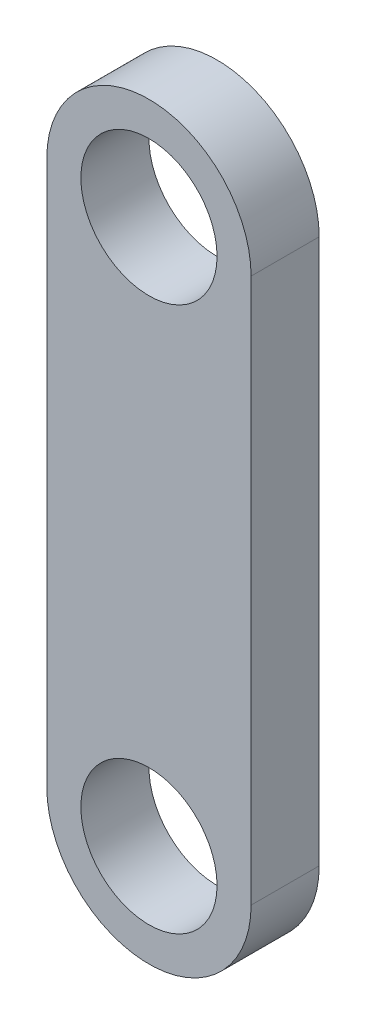
ISO-10303-21;
HEADER;
FILE_DESCRIPTION(('STEP AP214'),'2;1');
FILE_NAME('part.step','',(''),(''),'','','');
FILE_SCHEMA(('AUTOMOTIVE_DESIGN { 1 0 10303 214 1 1 1 1 }'));
ENDSEC;
DATA;
#1=APPLICATION_CONTEXT('core data for automotive mechanical design processes');
#2=APPLICATION_PROTOCOL_DEFINITION('international standard','automotive_design',2000,#1);
#3=PRODUCT_CONTEXT('',#1,'mechanical');
#4=PRODUCT('Part','Part','',(#3));
#5=PRODUCT_RELATED_PRODUCT_CATEGORY('part','',(#4));
#6=PRODUCT_DEFINITION_FORMATION('','',#4);
#7=PRODUCT_DEFINITION_CONTEXT('part definition',#1,'design');
#8=PRODUCT_DEFINITION('design','',#6,#7);
#9=PRODUCT_DEFINITION_SHAPE('','',#8);
#10=(LENGTH_UNIT() NAMED_UNIT(*) SI_UNIT(.MILLI.,.METRE.));
#11=(NAMED_UNIT(*) PLANE_ANGLE_UNIT() SI_UNIT($,.RADIAN.));
#12=(NAMED_UNIT(*) SI_UNIT($,.STERADIAN.) SOLID_ANGLE_UNIT());
#13=UNCERTAINTY_MEASURE_WITH_UNIT(LENGTH_MEASURE(1.E-05),#10,'distance_accuracy_value','');
#14=(GEOMETRIC_REPRESENTATION_CONTEXT(3) GLOBAL_UNCERTAINTY_ASSIGNED_CONTEXT((#13)) GLOBAL_UNIT_ASSIGNED_CONTEXT((#10,
#11,#12)) REPRESENTATION_CONTEXT('',''));
#15=CARTESIAN_POINT('',(0.,0.,0.));
#16=DIRECTION('',(0.,0.,1.));
#17=DIRECTION('',(1.,0.,0.));
#18=AXIS2_PLACEMENT_3D('',#15,#16,#17);
#19=CARTESIAN_POINT('',(0.,0.,5.));
#20=DIRECTION('',(0.,0.,-1.));
#21=DIRECTION('',(-1.,0.,0.));
#22=AXIS2_PLACEMENT_3D('',#19,#20,#21);
#23=CYLINDRICAL_SURFACE('',#22,7.5);
#24=CARTESIAN_POINT('',(0.,0.,0.));
#25=DIRECTION('',(0.,0.,1.));
#26=DIRECTION('',(1.,0.,0.));
#27=AXIS2_PLACEMENT_3D('',#24,#25,#26);
#28=CIRCLE('',#27,7.5);
#29=CARTESIAN_POINT('',(-7.5,0.,0.));
#30=VERTEX_POINT('',#29);
#31=CARTESIAN_POINT('',(7.5,0.,0.));
#32=VERTEX_POINT('',#31);
#33=EDGE_CURVE('E107',#30,#32,#28,.T.);
#34=ORIENTED_EDGE('',*,*,#33,.T.);
#35=DIRECTION('',(0.,0.,-1.));
#36=VECTOR('',#35,1.);
#37=CARTESIAN_POINT('',(7.5,0.,5.));
#38=LINE('',#37,#36);
#39=CARTESIAN_POINT('',(7.5,0.,5.));
#40=VERTEX_POINT('',#39);
#41=EDGE_CURVE('E11',#40,#32,#38,.T.);
#42=ORIENTED_EDGE('',*,*,#41,.F.);
#43=CARTESIAN_POINT('',(0.,0.,5.));
#44=DIRECTION('',(0.,0.,1.));
#45=DIRECTION('',(1.,0.,0.));
#46=AXIS2_PLACEMENT_3D('',#43,#44,#45);
#47=CIRCLE('',#46,7.5);
#48=CARTESIAN_POINT('',(-7.5,0.,5.));
#49=VERTEX_POINT('',#48);
#50=EDGE_CURVE('E91',#49,#40,#47,.T.);
#51=ORIENTED_EDGE('',*,*,#50,.F.);
#52=DIRECTION('',(0.,0.,-1.));
#53=VECTOR('',#52,1.);
#54=CARTESIAN_POINT('',(-7.5,0.,5.));
#55=LINE('',#54,#53);
#56=EDGE_CURVE('E103',#49,#30,#55,.T.);
#57=ORIENTED_EDGE('',*,*,#56,.T.);
#58=EDGE_LOOP('',(#34,#42,#51,#57));
#59=FACE_BOUND('',#58,.T.);
#60=ADVANCED_FACE('F39',(#59),#23,.T.);
#61=CARTESIAN_POINT('',(7.5,0.,5.));
#62=DIRECTION('',(-1.,0.,0.));
#63=DIRECTION('',(0.,0.,1.));
#64=AXIS2_PLACEMENT_3D('',#61,#62,#63);
#65=PLANE('',#64);
#66=DIRECTION('',(0.,1.,0.));
#67=VECTOR('',#66,1.);
#68=CARTESIAN_POINT('',(7.5,0.,0.));
#69=LINE('',#68,#67);
#70=CARTESIAN_POINT('',(7.5,40.,0.));
#71=VERTEX_POINT('',#70);
#72=EDGE_CURVE('E96',#32,#71,#69,.T.);
#73=ORIENTED_EDGE('',*,*,#72,.T.);
#74=DIRECTION('',(0.,0.,-1.));
#75=VECTOR('',#74,1.);
#76=CARTESIAN_POINT('',(7.5,40.,5.));
#77=LINE('',#76,#75);
#78=CARTESIAN_POINT('',(7.5,40.,5.));
#79=VERTEX_POINT('',#78);
#80=EDGE_CURVE('E48',#79,#71,#77,.T.);
#81=ORIENTED_EDGE('',*,*,#80,.F.);
#82=DIRECTION('',(0.,1.,0.));
#83=VECTOR('',#82,1.);
#84=CARTESIAN_POINT('',(7.5,0.,5.));
#85=LINE('',#84,#83);
#86=EDGE_CURVE('E86',#40,#79,#85,.T.);
#87=ORIENTED_EDGE('',*,*,#86,.F.);
#88=ORIENTED_EDGE('',*,*,#41,.T.);
#89=EDGE_LOOP('',(#73,#81,#87,#88));
#90=FACE_BOUND('',#89,.T.);
#91=ADVANCED_FACE('F95',(#90),#65,.F.);
#92=CARTESIAN_POINT('',(0.,40.,5.));
#93=DIRECTION('',(0.,0.,-1.));
#94=DIRECTION('',(-1.,0.,0.));
#95=AXIS2_PLACEMENT_3D('',#92,#93,#94);
#96=CYLINDRICAL_SURFACE('',#95,7.5);
#97=CARTESIAN_POINT('',(0.,40.,0.));
#98=DIRECTION('',(0.,0.,1.));
#99=DIRECTION('',(1.,0.,0.));
#100=AXIS2_PLACEMENT_3D('',#97,#98,#99);
#101=CIRCLE('',#100,7.5);
#102=CARTESIAN_POINT('',(-7.5,40.,0.));
#103=VERTEX_POINT('',#102);
#104=EDGE_CURVE('E73',#71,#103,#101,.T.);
#105=ORIENTED_EDGE('',*,*,#104,.T.);
#106=DIRECTION('',(0.,0.,-1.));
#107=VECTOR('',#106,1.);
#108=CARTESIAN_POINT('',(-7.5,40.,5.));
#109=LINE('',#108,#107);
#110=CARTESIAN_POINT('',(-7.5,40.,5.));
#111=VERTEX_POINT('',#110);
#112=EDGE_CURVE('E98',#111,#103,#109,.T.);
#113=ORIENTED_EDGE('',*,*,#112,.F.);
#114=CARTESIAN_POINT('',(0.,40.,5.));
#115=DIRECTION('',(0.,0.,1.));
#116=DIRECTION('',(1.,0.,0.));
#117=AXIS2_PLACEMENT_3D('',#114,#115,#116);
#118=CIRCLE('',#117,7.5);
#119=EDGE_CURVE('E89',#79,#111,#118,.T.);
#120=ORIENTED_EDGE('',*,*,#119,.F.);
#121=ORIENTED_EDGE('',*,*,#80,.T.);
#122=EDGE_LOOP('',(#105,#113,#120,#121));
#123=FACE_BOUND('',#122,.T.);
#124=ADVANCED_FACE('F99',(#123),#96,.T.);
#125=CARTESIAN_POINT('',(-7.5,0.,5.));
#126=DIRECTION('',(1.,0.,0.));
#127=DIRECTION('',(0.,0.,-1.));
#128=AXIS2_PLACEMENT_3D('',#125,#126,#127);
#129=PLANE('',#128);
#130=DIRECTION('',(0.,-1.,0.));
#131=VECTOR('',#130,1.);
#132=CARTESIAN_POINT('',(-7.5,0.,0.));
#133=LINE('',#132,#131);
#134=EDGE_CURVE('E79',#103,#30,#133,.T.);
#135=ORIENTED_EDGE('',*,*,#134,.T.);
#136=ORIENTED_EDGE('',*,*,#56,.F.);
#137=DIRECTION('',(0.,-1.,0.));
#138=VECTOR('',#137,1.);
#139=CARTESIAN_POINT('',(-7.5,0.,5.));
#140=LINE('',#139,#138);
#141=EDGE_CURVE('E56',#111,#49,#140,.T.);
#142=ORIENTED_EDGE('',*,*,#141,.F.);
#143=ORIENTED_EDGE('',*,*,#112,.T.);
#144=EDGE_LOOP('',(#135,#136,#142,#143));
#145=FACE_BOUND('',#144,.T.);
#146=ADVANCED_FACE('F121',(#145),#129,.F.);
#147=CARTESIAN_POINT('',(0.,0.,5.));
#148=DIRECTION('',(0.,0.,1.));
#149=DIRECTION('',(1.,0.,0.));
#150=AXIS2_PLACEMENT_3D('',#147,#148,#149);
#151=PLANE('',#150);
#152=CARTESIAN_POINT('',(0.,40.,5.));
#153=DIRECTION('',(0.,0.,1.));
#154=DIRECTION('',(1.,0.,0.));
#155=AXIS2_PLACEMENT_3D('',#152,#153,#154);
#156=CIRCLE('',#155,5.);
#157=CARTESIAN_POINT('',(5.,40.,5.));
#158=VERTEX_POINT('',#157);
#159=EDGE_CURVE('E136',#158,#158,#156,.T.);
#160=ORIENTED_EDGE('',*,*,#159,.F.);
#161=EDGE_LOOP('',(#160));
#162=FACE_BOUND('',#161,.T.);
#163=CARTESIAN_POINT('',(0.,0.,5.));
#164=DIRECTION('',(0.,0.,1.));
#165=DIRECTION('',(1.,0.,0.));
#166=AXIS2_PLACEMENT_3D('',#163,#164,#165);
#167=CIRCLE('',#166,5.);
#168=CARTESIAN_POINT('',(5.,0.,5.));
#169=VERTEX_POINT('',#168);
#170=EDGE_CURVE('E128',#169,#169,#167,.T.);
#171=ORIENTED_EDGE('',*,*,#170,.F.);
#172=EDGE_LOOP('',(#171));
#173=FACE_BOUND('',#172,.T.);
#174=ORIENTED_EDGE('',*,*,#50,.T.);
#175=ORIENTED_EDGE('',*,*,#86,.T.);
#176=ORIENTED_EDGE('',*,*,#119,.T.);
#177=ORIENTED_EDGE('',*,*,#141,.T.);
#178=EDGE_LOOP('',(#174,#175,#176,#177));
#179=FACE_BOUND('',#178,.T.);
#180=ADVANCED_FACE('F87',(#162,#173,#179),#151,.T.);
#181=CARTESIAN_POINT('',(0.,0.,0.));
#182=DIRECTION('',(0.,0.,1.));
#183=DIRECTION('',(1.,0.,0.));
#184=AXIS2_PLACEMENT_3D('',#181,#182,#183);
#185=PLANE('',#184);
#186=CARTESIAN_POINT('',(0.,40.,0.));
#187=DIRECTION('',(0.,0.,1.));
#188=DIRECTION('',(1.,0.,0.));
#189=AXIS2_PLACEMENT_3D('',#186,#187,#188);
#190=CIRCLE('',#189,5.);
#191=CARTESIAN_POINT('',(5.,40.,0.));
#192=VERTEX_POINT('',#191);
#193=EDGE_CURVE('E111',#192,#192,#190,.T.);
#194=ORIENTED_EDGE('',*,*,#193,.T.);
#195=EDGE_LOOP('',(#194));
#196=FACE_BOUND('',#195,.T.);
#197=CARTESIAN_POINT('',(0.,0.,0.));
#198=DIRECTION('',(0.,0.,1.));
#199=DIRECTION('',(1.,0.,0.));
#200=AXIS2_PLACEMENT_3D('',#197,#198,#199);
#201=CIRCLE('',#200,5.);
#202=CARTESIAN_POINT('',(5.,0.,0.));
#203=VERTEX_POINT('',#202);
#204=EDGE_CURVE('E132',#203,#203,#201,.T.);
#205=ORIENTED_EDGE('',*,*,#204,.T.);
#206=EDGE_LOOP('',(#205));
#207=FACE_BOUND('',#206,.T.);
#208=ORIENTED_EDGE('',*,*,#33,.F.);
#209=ORIENTED_EDGE('',*,*,#134,.F.);
#210=ORIENTED_EDGE('',*,*,#104,.F.);
#211=ORIENTED_EDGE('',*,*,#72,.F.);
#212=EDGE_LOOP('',(#208,#209,#210,#211));
#213=FACE_BOUND('',#212,.T.);
#214=ADVANCED_FACE('F124',(#196,#207,#213),#185,.F.);
#215=CARTESIAN_POINT('',(0.,0.,0.));
#216=DIRECTION('',(0.,0.,1.));
#217=DIRECTION('',(1.,0.,0.));
#218=AXIS2_PLACEMENT_3D('',#215,#216,#217);
#219=CYLINDRICAL_SURFACE('',#218,5.);
#220=ORIENTED_EDGE('',*,*,#204,.F.);
#221=EDGE_LOOP('',(#220));
#222=FACE_BOUND('',#221,.T.);
#223=ORIENTED_EDGE('',*,*,#170,.T.);
#224=EDGE_LOOP('',(#223));
#225=FACE_BOUND('',#224,.T.);
#226=ADVANCED_FACE('F149',(#222,#225),#219,.F.);
#227=CARTESIAN_POINT('',(0.,40.,0.));
#228=DIRECTION('',(0.,0.,1.));
#229=DIRECTION('',(1.,0.,0.));
#230=AXIS2_PLACEMENT_3D('',#227,#228,#229);
#231=CYLINDRICAL_SURFACE('',#230,5.);
#232=ORIENTED_EDGE('',*,*,#193,.F.);
#233=EDGE_LOOP('',(#232));
#234=FACE_BOUND('',#233,.T.);
#235=ORIENTED_EDGE('',*,*,#159,.T.);
#236=EDGE_LOOP('',(#235));
#237=FACE_BOUND('',#236,.T.);
#238=ADVANCED_FACE('F146',(#234,#237),#231,.F.);
#239=CLOSED_SHELL('',(#60,#91,#124,#146,#180,#214,#226,#238));
#240=MANIFOLD_SOLID_BREP('B2',#239);
#241=ADVANCED_BREP_SHAPE_REPRESENTATION('',(#18,#240),#14);
#242=SHAPE_DEFINITION_REPRESENTATION(#9,#241);
ENDSEC;
END-ISO-10303-21;
